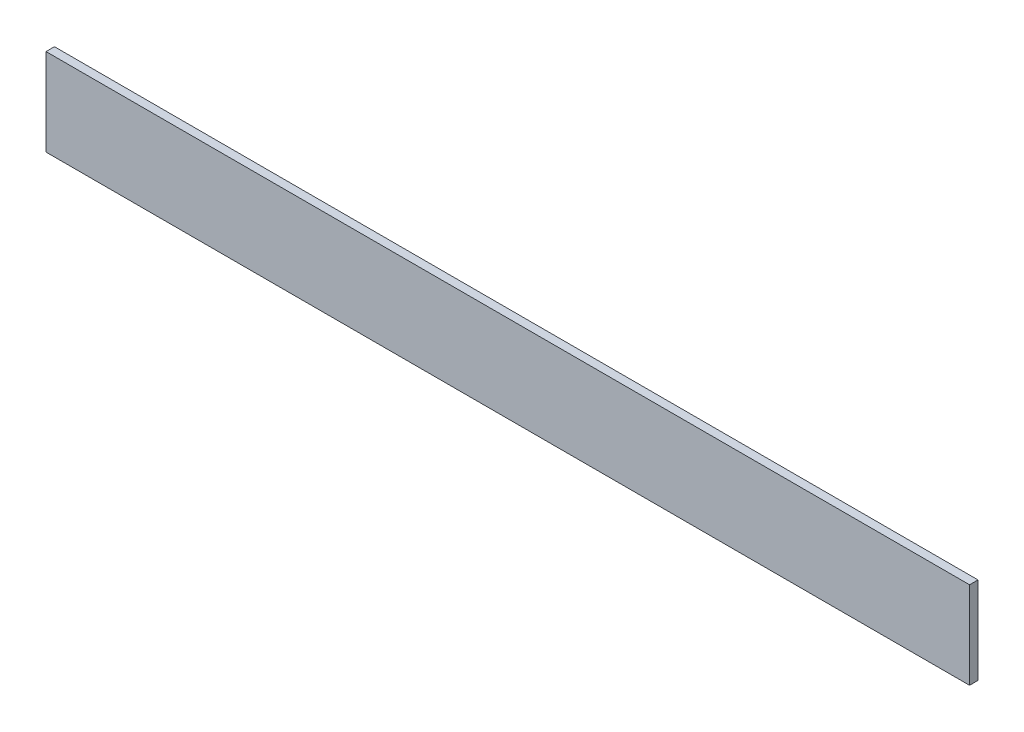
ISO-10303-21;
HEADER;
FILE_DESCRIPTION(('STEP AP214'),'2;1');
FILE_NAME('part.step','',(''),(''),'','','');
FILE_SCHEMA(('AUTOMOTIVE_DESIGN { 1 0 10303 214 1 1 1 1 }'));
ENDSEC;
DATA;
#1=APPLICATION_CONTEXT('core data for automotive mechanical design processes');
#2=APPLICATION_PROTOCOL_DEFINITION('international standard','automotive_design',2000,#1);
#3=PRODUCT_CONTEXT('',#1,'mechanical');
#4=PRODUCT('Part','Part','',(#3));
#5=PRODUCT_RELATED_PRODUCT_CATEGORY('part','',(#4));
#6=PRODUCT_DEFINITION_FORMATION('','',#4);
#7=PRODUCT_DEFINITION_CONTEXT('part definition',#1,'design');
#8=PRODUCT_DEFINITION('design','',#6,#7);
#9=PRODUCT_DEFINITION_SHAPE('','',#8);
#10=(LENGTH_UNIT() NAMED_UNIT(*) SI_UNIT(.MILLI.,.METRE.));
#11=(NAMED_UNIT(*) PLANE_ANGLE_UNIT() SI_UNIT($,.RADIAN.));
#12=(NAMED_UNIT(*) SI_UNIT($,.STERADIAN.) SOLID_ANGLE_UNIT());
#13=UNCERTAINTY_MEASURE_WITH_UNIT(LENGTH_MEASURE(1.E-05),#10,'distance_accuracy_value','');
#14=(GEOMETRIC_REPRESENTATION_CONTEXT(3) GLOBAL_UNCERTAINTY_ASSIGNED_CONTEXT((#13)) GLOBAL_UNIT_ASSIGNED_CONTEXT((#10,
#11,#12)) REPRESENTATION_CONTEXT('',''));
#15=CARTESIAN_POINT('',(0.,0.,0.));
#16=DIRECTION('',(0.,0.,1.));
#17=DIRECTION('',(1.,0.,0.));
#18=AXIS2_PLACEMENT_3D('',#15,#16,#17);
#19=CARTESIAN_POINT('',(87.5000000000001,8.25,0.8));
#20=DIRECTION('',(-1.,0.,0.));
#21=DIRECTION('',(0.,0.,1.));
#22=AXIS2_PLACEMENT_3D('',#19,#20,#21);
#23=PLANE('',#22);
#24=DIRECTION('',(0.,1.,0.));
#25=VECTOR('',#24,1.);
#26=CARTESIAN_POINT('',(87.5000000000001,8.25,-0.8));
#27=LINE('',#26,#25);
#28=CARTESIAN_POINT('',(87.5000000000001,-8.25,-0.8));
#29=VERTEX_POINT('',#28);
#30=CARTESIAN_POINT('',(87.5000000000001,8.25,-0.8));
#31=VERTEX_POINT('',#30);
#32=EDGE_CURVE('E98',#29,#31,#27,.T.);
#33=ORIENTED_EDGE('',*,*,#32,.T.);
#34=DIRECTION('',(0.,0.,-1.));
#35=VECTOR('',#34,1.);
#36=CARTESIAN_POINT('',(87.5000000000001,8.25,0.8));
#37=LINE('',#36,#35);
#38=CARTESIAN_POINT('',(87.5000000000001,8.25,0.8));
#39=VERTEX_POINT('',#38);
#40=EDGE_CURVE('E11',#39,#31,#37,.T.);
#41=ORIENTED_EDGE('',*,*,#40,.F.);
#42=DIRECTION('',(0.,1.,0.));
#43=VECTOR('',#42,1.);
#44=CARTESIAN_POINT('',(87.5000000000001,8.25,0.8));
#45=LINE('',#44,#43);
#46=CARTESIAN_POINT('',(87.5000000000001,-8.25,0.8));
#47=VERTEX_POINT('',#46);
#48=EDGE_CURVE('E86',#47,#39,#45,.T.);
#49=ORIENTED_EDGE('',*,*,#48,.F.);
#50=DIRECTION('',(0.,0.,-1.));
#51=VECTOR('',#50,1.);
#52=CARTESIAN_POINT('',(87.5000000000001,-8.25,0.8));
#53=LINE('',#52,#51);
#54=EDGE_CURVE('E94',#47,#29,#53,.T.);
#55=ORIENTED_EDGE('',*,*,#54,.T.);
#56=EDGE_LOOP('',(#33,#41,#49,#55));
#57=FACE_BOUND('',#56,.T.);
#58=ADVANCED_FACE('F35',(#57),#23,.F.);
#59=CARTESIAN_POINT('',(-87.4999999999999,8.25,0.8));
#60=DIRECTION('',(0.,-1.,0.));
#61=DIRECTION('',(0.,0.,-1.));
#62=AXIS2_PLACEMENT_3D('',#59,#60,#61);
#63=PLANE('',#62);
#64=DIRECTION('',(-1.,0.,0.));
#65=VECTOR('',#64,1.);
#66=CARTESIAN_POINT('',(-87.4999999999999,8.25,-0.8));
#67=LINE('',#66,#65);
#68=CARTESIAN_POINT('',(-87.4999999999999,8.25,-0.8));
#69=VERTEX_POINT('',#68);
#70=EDGE_CURVE('E90',#31,#69,#67,.T.);
#71=ORIENTED_EDGE('',*,*,#70,.T.);
#72=DIRECTION('',(0.,0.,-1.));
#73=VECTOR('',#72,1.);
#74=CARTESIAN_POINT('',(-87.4999999999999,8.25,0.8));
#75=LINE('',#74,#73);
#76=CARTESIAN_POINT('',(-87.4999999999999,8.25,0.8));
#77=VERTEX_POINT('',#76);
#78=EDGE_CURVE('E43',#77,#69,#75,.T.);
#79=ORIENTED_EDGE('',*,*,#78,.F.);
#80=DIRECTION('',(-1.,0.,0.));
#81=VECTOR('',#80,1.);
#82=CARTESIAN_POINT('',(-87.4999999999999,8.25,0.8));
#83=LINE('',#82,#81);
#84=EDGE_CURVE('E81',#39,#77,#83,.T.);
#85=ORIENTED_EDGE('',*,*,#84,.F.);
#86=ORIENTED_EDGE('',*,*,#40,.T.);
#87=EDGE_LOOP('',(#71,#79,#85,#86));
#88=FACE_BOUND('',#87,.T.);
#89=ADVANCED_FACE('F89',(#88),#63,.F.);
#90=CARTESIAN_POINT('',(-87.4999999999999,8.25,0.8));
#91=DIRECTION('',(1.,0.,0.));
#92=DIRECTION('',(0.,1.,0.));
#93=AXIS2_PLACEMENT_3D('',#90,#91,#92);
#94=PLANE('',#93);
#95=DIRECTION('',(0.,-1.,0.));
#96=VECTOR('',#95,1.);
#97=CARTESIAN_POINT('',(-87.4999999999999,8.25,-0.8));
#98=LINE('',#97,#96);
#99=CARTESIAN_POINT('',(-87.4999999999999,-8.25,-0.8));
#100=VERTEX_POINT('',#99);
#101=EDGE_CURVE('E68',#69,#100,#98,.T.);
#102=ORIENTED_EDGE('',*,*,#101,.T.);
#103=DIRECTION('',(0.,0.,-1.));
#104=VECTOR('',#103,1.);
#105=CARTESIAN_POINT('',(-87.4999999999999,-8.25,0.8));
#106=LINE('',#105,#104);
#107=CARTESIAN_POINT('',(-87.4999999999999,-8.25,0.8));
#108=VERTEX_POINT('',#107);
#109=EDGE_CURVE('E91',#108,#100,#106,.T.);
#110=ORIENTED_EDGE('',*,*,#109,.F.);
#111=DIRECTION('',(0.,-1.,0.));
#112=VECTOR('',#111,1.);
#113=CARTESIAN_POINT('',(-87.4999999999999,8.25,0.8));
#114=LINE('',#113,#112);
#115=EDGE_CURVE('E84',#77,#108,#114,.T.);
#116=ORIENTED_EDGE('',*,*,#115,.F.);
#117=ORIENTED_EDGE('',*,*,#78,.T.);
#118=EDGE_LOOP('',(#102,#110,#116,#117));
#119=FACE_BOUND('',#118,.T.);
#120=ADVANCED_FACE('F92',(#119),#94,.F.);
#121=CARTESIAN_POINT('',(-87.4999999999999,-8.25,0.8));
#122=DIRECTION('',(0.,1.,0.));
#123=DIRECTION('',(0.,0.,1.));
#124=AXIS2_PLACEMENT_3D('',#121,#122,#123);
#125=PLANE('',#124);
#126=DIRECTION('',(1.,0.,0.));
#127=VECTOR('',#126,1.);
#128=CARTESIAN_POINT('',(-87.4999999999999,-8.25,-0.8));
#129=LINE('',#128,#127);
#130=EDGE_CURVE('E74',#100,#29,#129,.T.);
#131=ORIENTED_EDGE('',*,*,#130,.T.);
#132=ORIENTED_EDGE('',*,*,#54,.F.);
#133=DIRECTION('',(1.,0.,0.));
#134=VECTOR('',#133,1.);
#135=CARTESIAN_POINT('',(-87.4999999999999,-8.25,0.8));
#136=LINE('',#135,#134);
#137=EDGE_CURVE('E51',#108,#47,#136,.T.);
#138=ORIENTED_EDGE('',*,*,#137,.F.);
#139=ORIENTED_EDGE('',*,*,#109,.T.);
#140=EDGE_LOOP('',(#131,#132,#138,#139));
#141=FACE_BOUND('',#140,.T.);
#142=ADVANCED_FACE('F105',(#141),#125,.F.);
#143=CARTESIAN_POINT('',(0.,0.,0.8));
#144=DIRECTION('',(0.,0.,1.));
#145=DIRECTION('',(1.,0.,0.));
#146=AXIS2_PLACEMENT_3D('',#143,#144,#145);
#147=PLANE('',#146);
#148=ORIENTED_EDGE('',*,*,#48,.T.);
#149=ORIENTED_EDGE('',*,*,#84,.T.);
#150=ORIENTED_EDGE('',*,*,#115,.T.);
#151=ORIENTED_EDGE('',*,*,#137,.T.);
#152=EDGE_LOOP('',(#148,#149,#150,#151));
#153=FACE_BOUND('',#152,.T.);
#154=ADVANCED_FACE('F82',(#153),#147,.T.);
#155=CARTESIAN_POINT('',(0.,0.,-0.8));
#156=DIRECTION('',(0.,0.,1.));
#157=DIRECTION('',(1.,0.,0.));
#158=AXIS2_PLACEMENT_3D('',#155,#156,#157);
#159=PLANE('',#158);
#160=ORIENTED_EDGE('',*,*,#32,.F.);
#161=ORIENTED_EDGE('',*,*,#130,.F.);
#162=ORIENTED_EDGE('',*,*,#101,.F.);
#163=ORIENTED_EDGE('',*,*,#70,.F.);
#164=EDGE_LOOP('',(#160,#161,#162,#163));
#165=FACE_BOUND('',#164,.T.);
#166=ADVANCED_FACE('F108',(#165),#159,.F.);
#167=CLOSED_SHELL('',(#58,#89,#120,#142,#154,#166));
#168=MANIFOLD_SOLID_BREP('B2',#167);
#169=ADVANCED_BREP_SHAPE_REPRESENTATION('',(#18,#168),#14);
#170=SHAPE_DEFINITION_REPRESENTATION(#9,#169);
ENDSEC;
END-ISO-10303-21;
